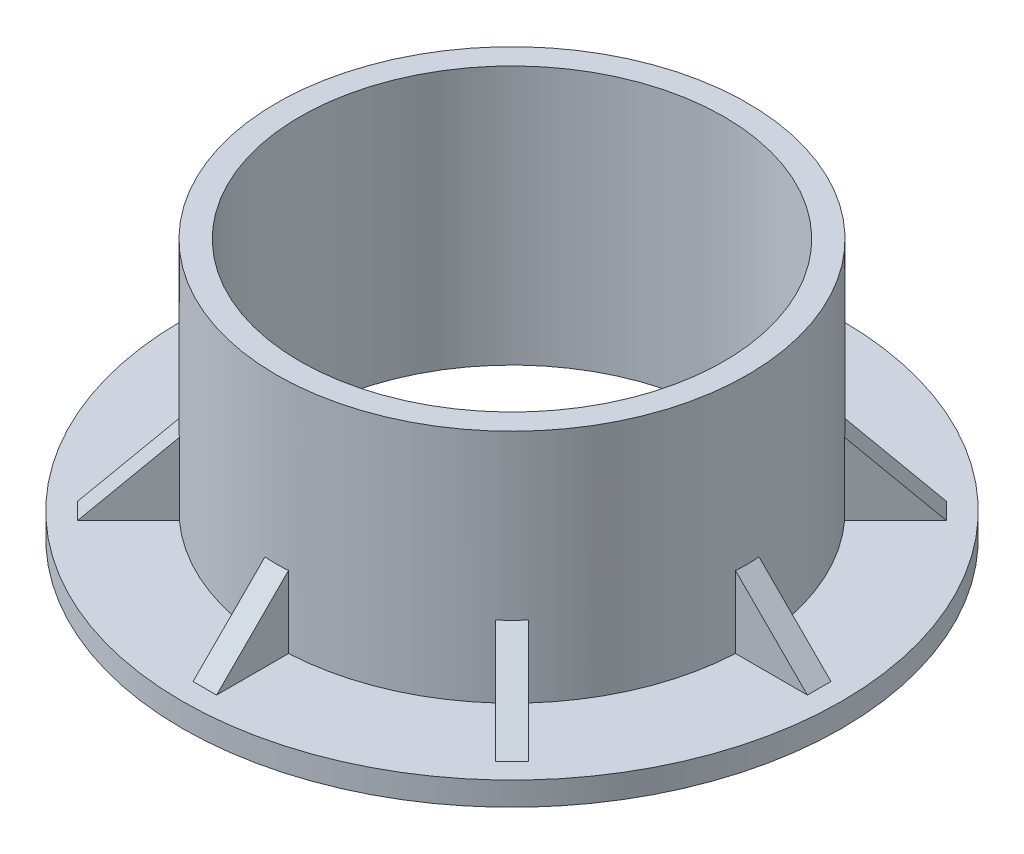
ISO-10303-21;
HEADER;
FILE_DESCRIPTION(('STEP AP214'),'2;1');
FILE_NAME('part.step','',(''),(''),'','','');
FILE_SCHEMA(('AUTOMOTIVE_DESIGN { 1 0 10303 214 1 1 1 1 }'));
ENDSEC;
DATA;
#1=APPLICATION_CONTEXT('core data for automotive mechanical design processes');
#2=APPLICATION_PROTOCOL_DEFINITION('international standard','automotive_design',2000,#1);
#3=PRODUCT_CONTEXT('',#1,'mechanical');
#4=PRODUCT('Part','Part','',(#3));
#5=PRODUCT_RELATED_PRODUCT_CATEGORY('part','',(#4));
#6=PRODUCT_DEFINITION_FORMATION('','',#4);
#7=PRODUCT_DEFINITION_CONTEXT('part definition',#1,'design');
#8=PRODUCT_DEFINITION('design','',#6,#7);
#9=PRODUCT_DEFINITION_SHAPE('','',#8);
#10=(LENGTH_UNIT() NAMED_UNIT(*) SI_UNIT(.MILLI.,.METRE.));
#11=(NAMED_UNIT(*) PLANE_ANGLE_UNIT() SI_UNIT($,.RADIAN.));
#12=(NAMED_UNIT(*) SI_UNIT($,.STERADIAN.) SOLID_ANGLE_UNIT());
#13=UNCERTAINTY_MEASURE_WITH_UNIT(LENGTH_MEASURE(1.E-05),#10,'distance_accuracy_value','');
#14=(GEOMETRIC_REPRESENTATION_CONTEXT(3) GLOBAL_UNCERTAINTY_ASSIGNED_CONTEXT((#13)) GLOBAL_UNIT_ASSIGNED_CONTEXT((#10,
#11,#12)) REPRESENTATION_CONTEXT('',''));
#15=CARTESIAN_POINT('',(0.,0.,0.));
#16=DIRECTION('',(0.,0.,1.));
#17=DIRECTION('',(1.,0.,0.));
#18=AXIS2_PLACEMENT_3D('',#15,#16,#17);
#19=CARTESIAN_POINT('',(0.,50.,0.));
#20=DIRECTION('',(0.,1.,0.));
#21=DIRECTION('',(0.,0.,1.));
#22=AXIS2_PLACEMENT_3D('',#19,#20,#21);
#23=PLANE('',#22);
#24=CARTESIAN_POINT('',(0.,50.,0.));
#25=DIRECTION('',(0.,1.,0.));
#26=DIRECTION('',(0.,0.,1.));
#27=AXIS2_PLACEMENT_3D('',#24,#25,#26);
#28=CIRCLE('',#27,50.);
#29=CARTESIAN_POINT('',(0.,50.,50.));
#30=VERTEX_POINT('',#29);
#31=EDGE_CURVE('E11',#30,#30,#28,.T.);
#32=ORIENTED_EDGE('',*,*,#31,.T.);
#33=EDGE_LOOP('',(#32));
#34=FACE_BOUND('',#33,.T.);
#35=CARTESIAN_POINT('',(0.,50.,0.));
#36=DIRECTION('',(0.,1.,0.));
#37=DIRECTION('',(0.,0.,1.));
#38=AXIS2_PLACEMENT_3D('',#35,#36,#37);
#39=CIRCLE('',#38,45.);
#40=CARTESIAN_POINT('',(0.,50.,45.));
#41=VERTEX_POINT('',#40);
#42=EDGE_CURVE('E41',#41,#41,#39,.T.);
#43=ORIENTED_EDGE('',*,*,#42,.F.);
#44=EDGE_LOOP('',(#43));
#45=FACE_BOUND('',#44,.T.);
#46=ADVANCED_FACE('F33',(#34,#45),#23,.T.);
#47=CARTESIAN_POINT('',(0.,50.,0.));
#48=DIRECTION('',(0.,-1.,0.));
#49=DIRECTION('',(0.,0.,-1.));
#50=AXIS2_PLACEMENT_3D('',#47,#48,#49);
#51=CYLINDRICAL_SURFACE('',#50,50.);
#52=ORIENTED_EDGE('',*,*,#31,.F.);
#53=EDGE_LOOP('',(#52));
#54=FACE_BOUND('',#53,.T.);
#55=DIRECTION('',(0.,-1.,0.));
#56=VECTOR('',#55,1.);
#57=CARTESIAN_POINT('',(-33.5433502765973,50.,-37.0788841825304));
#58=LINE('',#57,#56);
#59=CARTESIAN_POINT('',(-33.5433502765973,15.2819727855431,-37.0788841825304));
#60=VERTEX_POINT('',#59);
#61=CARTESIAN_POINT('',(-33.5433502765973,0.,-37.0788841825304));
#62=VERTEX_POINT('',#61);
#63=EDGE_CURVE('E289',#60,#62,#58,.T.);
#64=ORIENTED_EDGE('',*,*,#63,.F.);
#65=CARTESIAN_POINT('',(0.,65.2194336741394,0.));
#66=DIRECTION('',(-0.500000000000002,0.707106781186541,-0.500000000000007));
#67=DIRECTION('',(-0.499999999999993,-0.707106781186554,-0.499999999999998));
#68=AXIS2_PLACEMENT_3D('',#65,#66,#67);
#69=ELLIPSE('',#68,70.7106781186554,50.);
#70=CARTESIAN_POINT('',(-37.07888418253,15.2819727855431,-33.5433502765977));
#71=VERTEX_POINT('',#70);
#72=EDGE_CURVE('E298',#60,#71,#69,.T.);
#73=ORIENTED_EDGE('',*,*,#72,.T.);
#74=DIRECTION('',(0.,-1.,0.));
#75=VECTOR('',#74,1.);
#76=CARTESIAN_POINT('',(-37.07888418253,50.,-33.5433502765977));
#77=LINE('',#76,#75);
#78=CARTESIAN_POINT('',(-37.07888418253,0.,-33.5433502765977));
#79=VERTEX_POINT('',#78);
#80=EDGE_CURVE('E294',#71,#79,#77,.T.);
#81=ORIENTED_EDGE('',*,*,#80,.T.);
#82=CARTESIAN_POINT('',(0.,0.,0.));
#83=DIRECTION('',(0.,-1.,0.));
#84=DIRECTION('',(0.,0.,-1.));
#85=AXIS2_PLACEMENT_3D('',#82,#83,#84);
#86=CIRCLE('',#85,50.);
#87=CARTESIAN_POINT('',(-49.9374608885954,0.,-2.50000000000017));
#88=VERTEX_POINT('',#87);
#89=EDGE_CURVE('E514',#88,#79,#86,.T.);
#90=ORIENTED_EDGE('',*,*,#89,.F.);
#91=DIRECTION('',(0.,-1.,0.));
#92=VECTOR('',#91,1.);
#93=CARTESIAN_POINT('',(-49.9374608885954,50.,-2.50000000000017));
#94=LINE('',#93,#92);
#95=CARTESIAN_POINT('',(-49.9374608885954,15.2819727855431,-2.50000000000017));
#96=VERTEX_POINT('',#95);
#97=EDGE_CURVE('E309',#96,#88,#94,.T.);
#98=ORIENTED_EDGE('',*,*,#97,.F.);
#99=CARTESIAN_POINT('',(0.,65.2194336741394,0.));
#100=DIRECTION('',(-0.707106781186554,0.707106781186541,0.));
#101=DIRECTION('',(-0.707106781186541,-0.707106781186554,0.));
#102=AXIS2_PLACEMENT_3D('',#99,#100,#101);
#103=ELLIPSE('',#102,70.7106781186554,50.);
#104=CARTESIAN_POINT('',(-49.9374608885955,15.2819727855431,2.49999999999983));
#105=VERTEX_POINT('',#104);
#106=EDGE_CURVE('E318',#96,#105,#103,.T.);
#107=ORIENTED_EDGE('',*,*,#106,.T.);
#108=DIRECTION('',(0.,-1.,0.));
#109=VECTOR('',#108,1.);
#110=CARTESIAN_POINT('',(-49.9374608885955,50.,2.49999999999983));
#111=LINE('',#110,#109);
#112=CARTESIAN_POINT('',(-49.9374608885955,0.,2.49999999999983));
#113=VERTEX_POINT('',#112);
#114=EDGE_CURVE('E314',#105,#113,#111,.T.);
#115=ORIENTED_EDGE('',*,*,#114,.T.);
#116=CARTESIAN_POINT('',(-37.0788841825303,0.,33.5433502765974));
#117=VERTEX_POINT('',#116);
#118=EDGE_CURVE('E373',#117,#113,#86,.T.);
#119=ORIENTED_EDGE('',*,*,#118,.F.);
#120=DIRECTION('',(0.,-1.,0.));
#121=VECTOR('',#120,1.);
#122=CARTESIAN_POINT('',(-37.0788841825303,50.,33.5433502765974));
#123=LINE('',#122,#121);
#124=CARTESIAN_POINT('',(-37.0788841825303,15.2819727855431,33.5433502765974));
#125=VERTEX_POINT('',#124);
#126=EDGE_CURVE('E329',#125,#117,#123,.T.);
#127=ORIENTED_EDGE('',*,*,#126,.F.);
#128=CARTESIAN_POINT('',(0.,65.2194336741394,0.));
#129=DIRECTION('',(-0.500000000000005,0.707106781186542,0.500000000000003));
#130=DIRECTION('',(-0.499999999999997,-0.707106781186554,0.499999999999995));
#131=AXIS2_PLACEMENT_3D('',#128,#129,#130);
#132=ELLIPSE('',#131,70.7106781186554,50.);
#133=CARTESIAN_POINT('',(-33.5433502765975,15.2819727855431,37.0788841825302));
#134=VERTEX_POINT('',#133);
#135=EDGE_CURVE('E338',#125,#134,#132,.T.);
#136=ORIENTED_EDGE('',*,*,#135,.T.);
#137=DIRECTION('',(0.,-1.,0.));
#138=VECTOR('',#137,1.);
#139=CARTESIAN_POINT('',(-33.5433502765975,50.,37.0788841825302));
#140=LINE('',#139,#138);
#141=CARTESIAN_POINT('',(-33.5433502765975,0.,37.0788841825302));
#142=VERTEX_POINT('',#141);
#143=EDGE_CURVE('E334',#134,#142,#140,.T.);
#144=ORIENTED_EDGE('',*,*,#143,.T.);
#145=CARTESIAN_POINT('',(-2.5,0.,49.9374608885955));
#146=VERTEX_POINT('',#145);
#147=EDGE_CURVE('E371',#146,#142,#86,.T.);
#148=ORIENTED_EDGE('',*,*,#147,.F.);
#149=DIRECTION('',(0.,-1.,0.));
#150=VECTOR('',#149,1.);
#151=CARTESIAN_POINT('',(-2.5,50.,49.9374608885955));
#152=LINE('',#151,#150);
#153=CARTESIAN_POINT('',(-2.5,15.2819727855431,49.9374608885955));
#154=VERTEX_POINT('',#153);
#155=EDGE_CURVE('E349',#154,#146,#152,.T.);
#156=ORIENTED_EDGE('',*,*,#155,.F.);
#157=CARTESIAN_POINT('',(0.,65.2194336741394,0.));
#158=DIRECTION('',(0.,0.707106781186541,0.707106781186554));
#159=DIRECTION('',(0.,-0.707106781186554,0.707106781186541));
#160=AXIS2_PLACEMENT_3D('',#157,#158,#159);
#161=ELLIPSE('',#160,70.7106781186554,50.);
#162=CARTESIAN_POINT('',(2.5,15.2819727855431,49.9374608885954));
#163=VERTEX_POINT('',#162);
#164=EDGE_CURVE('E359',#154,#163,#161,.T.);
#165=ORIENTED_EDGE('',*,*,#164,.T.);
#166=DIRECTION('',(0.,-1.,0.));
#167=VECTOR('',#166,1.);
#168=CARTESIAN_POINT('',(2.5,50.,49.9374608885955));
#169=LINE('',#168,#167);
#170=CARTESIAN_POINT('',(2.5,0.,49.9374608885955));
#171=VERTEX_POINT('',#170);
#172=EDGE_CURVE('E354',#163,#171,#169,.T.);
#173=ORIENTED_EDGE('',*,*,#172,.T.);
#174=CARTESIAN_POINT('',(33.543350276597,0.,37.0788841825306));
#175=VERTEX_POINT('',#174);
#176=EDGE_CURVE('E368',#175,#171,#86,.T.);
#177=ORIENTED_EDGE('',*,*,#176,.F.);
#178=DIRECTION('',(0.,-1.,0.));
#179=VECTOR('',#178,1.);
#180=CARTESIAN_POINT('',(33.543350276597,50.,37.0788841825306));
#181=LINE('',#180,#179);
#182=CARTESIAN_POINT('',(33.543350276597,15.2819727855431,37.0788841825306));
#183=VERTEX_POINT('',#182);
#184=EDGE_CURVE('E53',#183,#175,#181,.T.);
#185=ORIENTED_EDGE('',*,*,#184,.F.);
#186=CARTESIAN_POINT('',(0.,65.2194336741394,0.));
#187=DIRECTION('',(0.499999999999998,0.707106781186542,0.50000000000001));
#188=DIRECTION('',(0.49999999999999,-0.707106781186554,0.500000000000002));
#189=AXIS2_PLACEMENT_3D('',#186,#187,#188);
#190=ELLIPSE('',#189,70.7106781186554,50.);
#191=CARTESIAN_POINT('',(37.0788841825298,15.2819727855431,33.5433502765979));
#192=VERTEX_POINT('',#191);
#193=EDGE_CURVE('E48',#183,#192,#190,.T.);
#194=ORIENTED_EDGE('',*,*,#193,.T.);
#195=DIRECTION('',(0.,-1.,0.));
#196=VECTOR('',#195,1.);
#197=CARTESIAN_POINT('',(37.0788841825298,50.,33.5433502765979));
#198=LINE('',#197,#196);
#199=CARTESIAN_POINT('',(37.0788841825298,0.,33.5433502765979));
#200=VERTEX_POINT('',#199);
#201=EDGE_CURVE('E209',#192,#200,#198,.T.);
#202=ORIENTED_EDGE('',*,*,#201,.T.);
#203=CARTESIAN_POINT('',(49.9374608885954,0.,2.50000000000052));
#204=VERTEX_POINT('',#203);
#205=EDGE_CURVE('E493',#204,#200,#86,.T.);
#206=ORIENTED_EDGE('',*,*,#205,.F.);
#207=DIRECTION('',(0.,-1.,0.));
#208=VECTOR('',#207,1.);
#209=CARTESIAN_POINT('',(49.9374608885954,50.,2.50000000000052));
#210=LINE('',#209,#208);
#211=CARTESIAN_POINT('',(49.9374608885954,15.2819727855431,2.50000000000052));
#212=VERTEX_POINT('',#211);
#213=EDGE_CURVE('E233',#212,#204,#210,.T.);
#214=ORIENTED_EDGE('',*,*,#213,.F.);
#215=CARTESIAN_POINT('',(0.,65.2194336741394,0.));
#216=DIRECTION('',(0.707106781186554,0.707106781186541,0.));
#217=DIRECTION('',(0.707106781186541,-0.707106781186554,0.));
#218=AXIS2_PLACEMENT_3D('',#215,#216,#217);
#219=ELLIPSE('',#218,70.7106781186554,50.);
#220=CARTESIAN_POINT('',(49.9374608885955,15.2819727855431,-2.49999999999948));
#221=VERTEX_POINT('',#220);
#222=EDGE_CURVE('E238',#212,#221,#219,.T.);
#223=ORIENTED_EDGE('',*,*,#222,.T.);
#224=DIRECTION('',(0.,-1.,0.));
#225=VECTOR('',#224,1.);
#226=CARTESIAN_POINT('',(49.9374608885955,50.,-2.49999999999948));
#227=LINE('',#226,#225);
#228=CARTESIAN_POINT('',(49.9374608885955,0.,-2.49999999999948));
#229=VERTEX_POINT('',#228);
#230=EDGE_CURVE('E228',#221,#229,#227,.T.);
#231=ORIENTED_EDGE('',*,*,#230,.T.);
#232=CARTESIAN_POINT('',(37.0788841825305,0.,-33.5433502765971));
#233=VERTEX_POINT('',#232);
#234=EDGE_CURVE('E494',#233,#229,#86,.T.);
#235=ORIENTED_EDGE('',*,*,#234,.F.);
#236=DIRECTION('',(0.,-1.,0.));
#237=VECTOR('',#236,1.);
#238=CARTESIAN_POINT('',(37.0788841825305,50.,-33.5433502765971));
#239=LINE('',#238,#237);
#240=CARTESIAN_POINT('',(37.0788841825305,15.2819727855431,-33.5433502765971));
#241=VERTEX_POINT('',#240);
#242=EDGE_CURVE('E253',#241,#233,#239,.T.);
#243=ORIENTED_EDGE('',*,*,#242,.F.);
#244=CARTESIAN_POINT('',(0.,65.2194336741394,0.));
#245=DIRECTION('',(0.500000000000009,0.707106781186541,-0.5));
#246=DIRECTION('',(0.5,-0.707106781186554,-0.499999999999991));
#247=AXIS2_PLACEMENT_3D('',#244,#245,#246);
#248=ELLIPSE('',#247,70.7106781186554,50.);
#249=CARTESIAN_POINT('',(33.5433502765978,15.2819727855431,-37.0788841825299));
#250=VERTEX_POINT('',#249);
#251=EDGE_CURVE('E258',#241,#250,#248,.T.);
#252=ORIENTED_EDGE('',*,*,#251,.T.);
#253=DIRECTION('',(0.,-1.,0.));
#254=VECTOR('',#253,1.);
#255=CARTESIAN_POINT('',(33.5433502765978,50.,-37.0788841825299));
#256=LINE('',#255,#254);
#257=CARTESIAN_POINT('',(33.5433502765978,0.,-37.0788841825299));
#258=VERTEX_POINT('',#257);
#259=EDGE_CURVE('E248',#250,#258,#256,.T.);
#260=ORIENTED_EDGE('',*,*,#259,.T.);
#261=CARTESIAN_POINT('',(2.5,0.,-49.9374608885955));
#262=VERTEX_POINT('',#261);
#263=EDGE_CURVE('E496',#262,#258,#86,.T.);
#264=ORIENTED_EDGE('',*,*,#263,.F.);
#265=DIRECTION('',(0.,-1.,0.));
#266=VECTOR('',#265,1.);
#267=CARTESIAN_POINT('',(2.5,50.,-49.9374608885955));
#268=LINE('',#267,#266);
#269=CARTESIAN_POINT('',(2.5,15.2819727855431,-49.9374608885955));
#270=VERTEX_POINT('',#269);
#271=EDGE_CURVE('E273',#270,#262,#268,.T.);
#272=ORIENTED_EDGE('',*,*,#271,.F.);
#273=CARTESIAN_POINT('',(0.,65.2194336741394,0.));
#274=DIRECTION('',(0.,0.707106781186541,-0.707106781186554));
#275=DIRECTION('',(0.,-0.707106781186554,-0.707106781186541));
#276=AXIS2_PLACEMENT_3D('',#273,#274,#275);
#277=ELLIPSE('',#276,70.7106781186554,50.);
#278=CARTESIAN_POINT('',(-2.5,15.2819727855431,-49.9374608885954));
#279=VERTEX_POINT('',#278);
#280=EDGE_CURVE('E278',#270,#279,#277,.T.);
#281=ORIENTED_EDGE('',*,*,#280,.T.);
#282=DIRECTION('',(0.,-1.,0.));
#283=VECTOR('',#282,1.);
#284=CARTESIAN_POINT('',(-2.5,50.,-49.9374608885955));
#285=LINE('',#284,#283);
#286=CARTESIAN_POINT('',(-2.5,0.,-49.9374608885955));
#287=VERTEX_POINT('',#286);
#288=EDGE_CURVE('E268',#279,#287,#285,.T.);
#289=ORIENTED_EDGE('',*,*,#288,.T.);
#290=EDGE_CURVE('E516',#62,#287,#86,.T.);
#291=ORIENTED_EDGE('',*,*,#290,.F.);
#292=EDGE_LOOP('',(#64,#73,#81,#90,#98,#107,#115,#119,#127,#136,#144,#148,#156,#165,#173,#177,
#185,#194,#202,#206,#214,#223,#231,#235,#243,#252,#260,#264,#272,#281,#289,#291));
#293=FACE_BOUND('',#292,.T.);
#294=ADVANCED_FACE('F35',(#54,#293),#51,.T.);
#295=CARTESIAN_POINT('',(0.,50.,0.));
#296=DIRECTION('',(0.,-1.,0.));
#297=DIRECTION('',(0.,0.,-1.));
#298=AXIS2_PLACEMENT_3D('',#295,#296,#297);
#299=CYLINDRICAL_SURFACE('',#298,45.);
#300=CARTESIAN_POINT('',(0.,-5.,0.));
#301=DIRECTION('',(0.,-1.,0.));
#302=DIRECTION('',(0.,0.,-1.));
#303=AXIS2_PLACEMENT_3D('',#300,#301,#302);
#304=CIRCLE('',#303,45.);
#305=CARTESIAN_POINT('',(0.,-5.,-45.));
#306=VERTEX_POINT('',#305);
#307=EDGE_CURVE('E361',#306,#306,#304,.T.);
#308=ORIENTED_EDGE('',*,*,#307,.T.);
#309=EDGE_LOOP('',(#308));
#310=FACE_BOUND('',#309,.T.);
#311=ORIENTED_EDGE('',*,*,#42,.T.);
#312=EDGE_LOOP('',(#311));
#313=FACE_BOUND('',#312,.T.);
#314=ADVANCED_FACE('F377',(#310,#313),#299,.F.);
#315=CARTESIAN_POINT('',(0.,0.,0.));
#316=DIRECTION('',(0.,-1.,0.));
#317=DIRECTION('',(0.,0.,-1.));
#318=AXIS2_PLACEMENT_3D('',#315,#316,#317);
#319=PLANE('',#318);
#320=DIRECTION('',(0.707106781186551,0.,-0.707106781186544));
#321=VECTOR('',#320,1.);
#322=CARTESIAN_POINT('',(-46.1171038161292,0.,-46.1171038161297));
#323=LINE('',#322,#321);
#324=CARTESIAN_POINT('',(-47.8848707690956,0.,-44.3493368631633));
#325=VERTEX_POINT('',#324);
#326=CARTESIAN_POINT('',(-44.3493368631628,0.,-47.8848707690961));
#327=VERTEX_POINT('',#326);
#328=EDGE_CURVE('E296',#325,#327,#323,.T.);
#329=ORIENTED_EDGE('',*,*,#328,.T.);
#330=DIRECTION('',(-0.707106781186544,0.,-0.707106781186551));
#331=VECTOR('',#330,1.);
#332=CARTESIAN_POINT('',(1.76776695296638,0.,-1.76776695296636));
#333=LINE('',#332,#331);
#334=EDGE_CURVE('E284',#62,#327,#333,.T.);
#335=ORIENTED_EDGE('',*,*,#334,.F.);
#336=ORIENTED_EDGE('',*,*,#290,.T.);
#337=DIRECTION('',(0.,0.,-1.));
#338=VECTOR('',#337,1.);
#339=CARTESIAN_POINT('',(-2.5,0.,0.));
#340=LINE('',#339,#338);
#341=CARTESIAN_POINT('',(-2.5,0.,-65.2194336741383));
#342=VERTEX_POINT('',#341);
#343=EDGE_CURVE('E264',#287,#342,#340,.T.);
#344=ORIENTED_EDGE('',*,*,#343,.T.);
#345=DIRECTION('',(1.,0.,0.));
#346=VECTOR('',#345,1.);
#347=CARTESIAN_POINT('',(0.,0.,-65.2194336741383));
#348=LINE('',#347,#346);
#349=CARTESIAN_POINT('',(2.5,0.,-65.2194336741383));
#350=VERTEX_POINT('',#349);
#351=EDGE_CURVE('E276',#342,#350,#348,.T.);
#352=ORIENTED_EDGE('',*,*,#351,.T.);
#353=DIRECTION('',(0.,0.,-1.));
#354=VECTOR('',#353,1.);
#355=CARTESIAN_POINT('',(2.5,0.,0.));
#356=LINE('',#355,#354);
#357=EDGE_CURVE('E270',#262,#350,#356,.T.);
#358=ORIENTED_EDGE('',*,*,#357,.F.);
#359=ORIENTED_EDGE('',*,*,#263,.T.);
#360=DIRECTION('',(0.707106781186554,0.,-0.707106781186541));
#361=VECTOR('',#360,1.);
#362=CARTESIAN_POINT('',(-1.76776695296635,0.,-1.76776695296638));
#363=LINE('',#362,#361);
#364=CARTESIAN_POINT('',(44.3493368631635,0.,-47.8848707690954));
#365=VERTEX_POINT('',#364);
#366=EDGE_CURVE('E244',#258,#365,#363,.T.);
#367=ORIENTED_EDGE('',*,*,#366,.T.);
#368=DIRECTION('',(0.707106781186541,0.,0.707106781186554));
#369=VECTOR('',#368,1.);
#370=CARTESIAN_POINT('',(46.1171038161299,0.,-46.1171038161291));
#371=LINE('',#370,#369);
#372=CARTESIAN_POINT('',(47.8848707690962,0.,-44.3493368631627));
#373=VERTEX_POINT('',#372);
#374=EDGE_CURVE('E256',#365,#373,#371,.T.);
#375=ORIENTED_EDGE('',*,*,#374,.T.);
#376=DIRECTION('',(0.707106781186554,0.,-0.707106781186541));
#377=VECTOR('',#376,1.);
#378=CARTESIAN_POINT('',(1.76776695296636,0.,1.76776695296639));
#379=LINE('',#378,#377);
#380=EDGE_CURVE('E250',#233,#373,#379,.T.);
#381=ORIENTED_EDGE('',*,*,#380,.F.);
#382=ORIENTED_EDGE('',*,*,#234,.T.);
#383=DIRECTION('',(1.,0.,0.));
#384=VECTOR('',#383,1.);
#385=CARTESIAN_POINT('',(0.,0.,-2.5));
#386=LINE('',#385,#384);
#387=CARTESIAN_POINT('',(65.2194336741383,0.,-2.5000000000005));
#388=VERTEX_POINT('',#387);
#389=EDGE_CURVE('E224',#229,#388,#386,.T.);
#390=ORIENTED_EDGE('',*,*,#389,.T.);
#391=DIRECTION('',(0.,0.,1.));
#392=VECTOR('',#391,1.);
#393=CARTESIAN_POINT('',(65.2194336741383,0.,6.83137306809514E-13));
#394=LINE('',#393,#392);
#395=CARTESIAN_POINT('',(65.2194336741383,0.,2.50000000000068));
#396=VERTEX_POINT('',#395);
#397=EDGE_CURVE('E236',#388,#396,#394,.T.);
#398=ORIENTED_EDGE('',*,*,#397,.T.);
#399=DIRECTION('',(1.,0.,0.));
#400=VECTOR('',#399,1.);
#401=CARTESIAN_POINT('',(0.,0.,2.5));
#402=LINE('',#401,#400);
#403=EDGE_CURVE('E230',#204,#396,#402,.T.);
#404=ORIENTED_EDGE('',*,*,#403,.F.);
#405=ORIENTED_EDGE('',*,*,#205,.T.);
#406=DIRECTION('',(0.707106781186539,0.,0.707106781186556));
#407=VECTOR('',#406,1.);
#408=CARTESIAN_POINT('',(1.76776695296639,0.,-1.76776695296635));
#409=LINE('',#408,#407);
#410=CARTESIAN_POINT('',(47.8848707690953,0.,44.3493368631637));
#411=VERTEX_POINT('',#410);
#412=EDGE_CURVE('E199',#200,#411,#409,.T.);
#413=ORIENTED_EDGE('',*,*,#412,.T.);
#414=DIRECTION('',(-0.707106781186556,0.,0.707106781186539));
#415=VECTOR('',#414,1.);
#416=CARTESIAN_POINT('',(46.1171038161289,0.,46.11710381613));
#417=LINE('',#416,#415);
#418=CARTESIAN_POINT('',(44.3493368631625,0.,47.8848707690964));
#419=VERTEX_POINT('',#418);
#420=EDGE_CURVE('E192',#411,#419,#417,.T.);
#421=ORIENTED_EDGE('',*,*,#420,.T.);
#422=DIRECTION('',(0.707106781186539,0.,0.707106781186556));
#423=VECTOR('',#422,1.);
#424=CARTESIAN_POINT('',(-1.76776695296639,0.,1.76776695296635));
#425=LINE('',#424,#423);
#426=EDGE_CURVE('E196',#175,#419,#425,.T.);
#427=ORIENTED_EDGE('',*,*,#426,.F.);
#428=ORIENTED_EDGE('',*,*,#176,.T.);
#429=DIRECTION('',(0.,0.,1.));
#430=VECTOR('',#429,1.);
#431=CARTESIAN_POINT('',(2.5,0.,0.));
#432=LINE('',#431,#430);
#433=CARTESIAN_POINT('',(2.5,0.,65.2194336741383));
#434=VERTEX_POINT('',#433);
#435=EDGE_CURVE('E352',#171,#434,#432,.T.);
#436=ORIENTED_EDGE('',*,*,#435,.T.);
#437=DIRECTION('',(-1.,0.,0.));
#438=VECTOR('',#437,1.);
#439=CARTESIAN_POINT('',(0.,0.,65.2194336741383));
#440=LINE('',#439,#438);
#441=CARTESIAN_POINT('',(-2.5,0.,65.2194336741383));
#442=VERTEX_POINT('',#441);
#443=EDGE_CURVE('E357',#434,#442,#440,.T.);
#444=ORIENTED_EDGE('',*,*,#443,.T.);
#445=DIRECTION('',(0.,0.,1.));
#446=VECTOR('',#445,1.);
#447=CARTESIAN_POINT('',(-2.5,0.,0.));
#448=LINE('',#447,#446);
#449=EDGE_CURVE('E344',#146,#442,#448,.T.);
#450=ORIENTED_EDGE('',*,*,#449,.F.);
#451=ORIENTED_EDGE('',*,*,#147,.T.);
#452=DIRECTION('',(-0.707106781186549,0.,0.707106781186546));
#453=VECTOR('',#452,1.);
#454=CARTESIAN_POINT('',(1.76776695296637,0.,1.76776695296637));
#455=LINE('',#454,#453);
#456=CARTESIAN_POINT('',(-44.3493368631632,0.,47.8848707690958));
#457=VERTEX_POINT('',#456);
#458=EDGE_CURVE('E332',#142,#457,#455,.T.);
#459=ORIENTED_EDGE('',*,*,#458,.T.);
#460=DIRECTION('',(-0.707106781186546,0.,-0.707106781186549));
#461=VECTOR('',#460,1.);
#462=CARTESIAN_POINT('',(-46.1171038161295,0.,46.1171038161294));
#463=LINE('',#462,#461);
#464=CARTESIAN_POINT('',(-47.8848707690959,0.,44.349336863163));
#465=VERTEX_POINT('',#464);
#466=EDGE_CURVE('E336',#457,#465,#463,.T.);
#467=ORIENTED_EDGE('',*,*,#466,.T.);
#468=DIRECTION('',(-0.707106781186549,0.,0.707106781186546));
#469=VECTOR('',#468,1.);
#470=CARTESIAN_POINT('',(-1.76776695296637,0.,-1.76776695296637));
#471=LINE('',#470,#469);
#472=EDGE_CURVE('E324',#117,#465,#471,.T.);
#473=ORIENTED_EDGE('',*,*,#472,.F.);
#474=ORIENTED_EDGE('',*,*,#118,.T.);
#475=DIRECTION('',(-1.,0.,0.));
#476=VECTOR('',#475,1.);
#477=CARTESIAN_POINT('',(0.,0.,2.5));
#478=LINE('',#477,#476);
#479=CARTESIAN_POINT('',(-65.2194336741383,0.,2.50000000000017));
#480=VERTEX_POINT('',#479);
#481=EDGE_CURVE('E312',#113,#480,#478,.T.);
#482=ORIENTED_EDGE('',*,*,#481,.T.);
#483=DIRECTION('',(0.,0.,-1.));
#484=VECTOR('',#483,1.);
#485=CARTESIAN_POINT('',(-65.2194336741383,0.,-2.27712435603171E-13));
#486=LINE('',#485,#484);
#487=CARTESIAN_POINT('',(-65.2194336741383,0.,-2.50000000000023));
#488=VERTEX_POINT('',#487);
#489=EDGE_CURVE('E316',#480,#488,#486,.T.);
#490=ORIENTED_EDGE('',*,*,#489,.T.);
#491=DIRECTION('',(-1.,0.,0.));
#492=VECTOR('',#491,1.);
#493=CARTESIAN_POINT('',(0.,0.,-2.5));
#494=LINE('',#493,#492);
#495=EDGE_CURVE('E304',#88,#488,#494,.T.);
#496=ORIENTED_EDGE('',*,*,#495,.F.);
#497=ORIENTED_EDGE('',*,*,#89,.T.);
#498=DIRECTION('',(-0.707106781186544,0.,-0.707106781186551));
#499=VECTOR('',#498,1.);
#500=CARTESIAN_POINT('',(-1.76776695296638,0.,1.76776695296636));
#501=LINE('',#500,#499);
#502=EDGE_CURVE('E292',#79,#325,#501,.T.);
#503=ORIENTED_EDGE('',*,*,#502,.T.);
#504=EDGE_LOOP('',(#329,#335,#336,#344,#352,#358,#359,#367,#375,#381,#382,#390,#398,#404,#405,
#413,#421,#427,#428,#436,#444,#450,#451,#459,#467,#473,#474,#482,#490,#496,#497,#503));
#505=FACE_BOUND('',#504,.T.);
#506=CARTESIAN_POINT('',(0.,0.,0.));
#507=DIRECTION('',(0.,-1.,0.));
#508=DIRECTION('',(0.,0.,-1.));
#509=AXIS2_PLACEMENT_3D('',#506,#507,#508);
#510=CIRCLE('',#509,70.);
#511=CARTESIAN_POINT('',(0.,0.,-70.));
#512=VERTEX_POINT('',#511);
#513=EDGE_CURVE('E364',#512,#512,#510,.T.);
#514=ORIENTED_EDGE('',*,*,#513,.F.);
#515=EDGE_LOOP('',(#514));
#516=FACE_BOUND('',#515,.T.);
#517=ADVANCED_FACE('F194',(#505,#516),#319,.F.);
#518=CARTESIAN_POINT('',(0.,-5.,0.));
#519=DIRECTION('',(0.,-1.,0.));
#520=DIRECTION('',(0.,0.,-1.));
#521=AXIS2_PLACEMENT_3D('',#518,#519,#520);
#522=PLANE('',#521);
#523=ORIENTED_EDGE('',*,*,#307,.F.);
#524=EDGE_LOOP('',(#523));
#525=FACE_BOUND('',#524,.T.);
#526=CARTESIAN_POINT('',(0.,-5.,0.));
#527=DIRECTION('',(0.,-1.,0.));
#528=DIRECTION('',(0.,0.,-1.));
#529=AXIS2_PLACEMENT_3D('',#526,#527,#528);
#530=CIRCLE('',#529,70.);
#531=CARTESIAN_POINT('',(0.,-5.,-70.));
#532=VERTEX_POINT('',#531);
#533=EDGE_CURVE('E365',#532,#532,#530,.T.);
#534=ORIENTED_EDGE('',*,*,#533,.T.);
#535=EDGE_LOOP('',(#534));
#536=FACE_BOUND('',#535,.T.);
#537=ADVANCED_FACE('F393',(#525,#536),#522,.T.);
#538=CARTESIAN_POINT('',(0.,-5.,0.));
#539=DIRECTION('',(0.,1.,0.));
#540=DIRECTION('',(0.,0.,1.));
#541=AXIS2_PLACEMENT_3D('',#538,#539,#540);
#542=CYLINDRICAL_SURFACE('',#541,70.);
#543=ORIENTED_EDGE('',*,*,#513,.T.);
#544=EDGE_LOOP('',(#543));
#545=FACE_BOUND('',#544,.T.);
#546=ORIENTED_EDGE('',*,*,#533,.F.);
#547=EDGE_LOOP('',(#546));
#548=FACE_BOUND('',#547,.T.);
#549=ADVANCED_FACE('F389',(#545,#548),#542,.T.);
#550=CARTESIAN_POINT('',(0.,13.0447653467907,52.1746683273479));
#551=DIRECTION('',(0.,0.707106781186541,0.707106781186554));
#552=DIRECTION('',(0.,-0.707106781186554,0.707106781186541));
#553=AXIS2_PLACEMENT_3D('',#550,#551,#552);
#554=PLANE('',#553);
#555=ORIENTED_EDGE('',*,*,#164,.F.);
#556=DIRECTION('',(0.,-0.707106781186554,0.707106781186541));
#557=VECTOR('',#556,1.);
#558=CARTESIAN_POINT('',(-2.5,13.0447653467907,52.1746683273479));
#559=LINE('',#558,#557);
#560=EDGE_CURVE('E340',#154,#442,#559,.T.);
#561=ORIENTED_EDGE('',*,*,#560,.T.);
#562=ORIENTED_EDGE('',*,*,#443,.F.);
#563=DIRECTION('',(0.,-0.707106781186554,0.707106781186541));
#564=VECTOR('',#563,1.);
#565=CARTESIAN_POINT('',(2.5,13.0447653467907,52.1746683273479));
#566=LINE('',#565,#564);
#567=EDGE_CURVE('E341',#163,#434,#566,.T.);
#568=ORIENTED_EDGE('',*,*,#567,.F.);
#569=EDGE_LOOP('',(#555,#561,#562,#568));
#570=FACE_BOUND('',#569,.T.);
#571=ADVANCED_FACE('F392',(#570),#554,.T.);
#572=CARTESIAN_POINT('',(2.5,22.5,0.));
#573=DIRECTION('',(1.,0.,0.));
#574=DIRECTION('',(0.,0.,-1.));
#575=AXIS2_PLACEMENT_3D('',#572,#573,#574);
#576=PLANE('',#575);
#577=ORIENTED_EDGE('',*,*,#172,.F.);
#578=ORIENTED_EDGE('',*,*,#567,.T.);
#579=ORIENTED_EDGE('',*,*,#435,.F.);
#580=EDGE_LOOP('',(#577,#578,#579));
#581=FACE_BOUND('',#580,.T.);
#582=ADVANCED_FACE('F402',(#581),#576,.T.);
#583=CARTESIAN_POINT('',(-2.5,22.5,0.));
#584=DIRECTION('',(1.,0.,0.));
#585=DIRECTION('',(0.,0.,-1.));
#586=AXIS2_PLACEMENT_3D('',#583,#584,#585);
#587=PLANE('',#586);
#588=ORIENTED_EDGE('',*,*,#560,.F.);
#589=ORIENTED_EDGE('',*,*,#155,.T.);
#590=ORIENTED_EDGE('',*,*,#449,.T.);
#591=EDGE_LOOP('',(#588,#589,#590));
#592=FACE_BOUND('',#591,.T.);
#593=ADVANCED_FACE('F404',(#592),#587,.F.);
#594=CARTESIAN_POINT('',(-36.8930617804267,13.0447653467907,36.8930617804266));
#595=DIRECTION('',(-0.500000000000005,0.707106781186542,0.500000000000003));
#596=DIRECTION('',(-0.499999999999997,-0.707106781186554,0.499999999999995));
#597=AXIS2_PLACEMENT_3D('',#594,#595,#596);
#598=PLANE('',#597);
#599=ORIENTED_EDGE('',*,*,#135,.F.);
#600=DIRECTION('',(-0.499999999999997,-0.707106781186554,0.499999999999995));
#601=VECTOR('',#600,1.);
#602=CARTESIAN_POINT('',(-38.6608287333931,13.0447653467907,35.1252948274602));
#603=LINE('',#602,#601);
#604=EDGE_CURVE('E320',#125,#465,#603,.T.);
#605=ORIENTED_EDGE('',*,*,#604,.T.);
#606=ORIENTED_EDGE('',*,*,#466,.F.);
#607=DIRECTION('',(-0.499999999999997,-0.707106781186554,0.499999999999995));
#608=VECTOR('',#607,1.);
#609=CARTESIAN_POINT('',(-35.1252948274603,13.0447653467907,38.660828733393));
#610=LINE('',#609,#608);
#611=EDGE_CURVE('E321',#134,#457,#610,.T.);
#612=ORIENTED_EDGE('',*,*,#611,.F.);
#613=EDGE_LOOP('',(#599,#605,#606,#612));
#614=FACE_BOUND('',#613,.T.);
#615=ADVANCED_FACE('F407',(#614),#598,.T.);
#616=CARTESIAN_POINT('',(1.76776695296637,22.5,1.76776695296637));
#617=DIRECTION('',(0.707106781186546,0.,0.707106781186549));
#618=DIRECTION('',(0.707106781186549,0.,-0.707106781186546));
#619=AXIS2_PLACEMENT_3D('',#616,#617,#618);
#620=PLANE('',#619);
#621=ORIENTED_EDGE('',*,*,#143,.F.);
#622=ORIENTED_EDGE('',*,*,#611,.T.);
#623=ORIENTED_EDGE('',*,*,#458,.F.);
#624=EDGE_LOOP('',(#621,#622,#623));
#625=FACE_BOUND('',#624,.T.);
#626=ADVANCED_FACE('F414',(#625),#620,.T.);
#627=CARTESIAN_POINT('',(-1.76776695296637,22.5,-1.76776695296637));
#628=DIRECTION('',(0.707106781186546,0.,0.707106781186549));
#629=DIRECTION('',(0.707106781186549,0.,-0.707106781186546));
#630=AXIS2_PLACEMENT_3D('',#627,#628,#629);
#631=PLANE('',#630);
#632=ORIENTED_EDGE('',*,*,#604,.F.);
#633=ORIENTED_EDGE('',*,*,#126,.T.);
#634=ORIENTED_EDGE('',*,*,#472,.T.);
#635=EDGE_LOOP('',(#632,#633,#634));
#636=FACE_BOUND('',#635,.T.);
#637=ADVANCED_FACE('F416',(#636),#631,.F.);
#638=CARTESIAN_POINT('',(-52.1746683273479,13.0447653467907,-1.82166880825265E-13));
#639=DIRECTION('',(-0.707106781186554,0.707106781186541,0.));
#640=DIRECTION('',(-0.707106781186541,-0.707106781186554,0.));
#641=AXIS2_PLACEMENT_3D('',#638,#639,#640);
#642=PLANE('',#641);
#643=ORIENTED_EDGE('',*,*,#106,.F.);
#644=DIRECTION('',(-0.707106781186541,-0.707106781186554,0.));
#645=VECTOR('',#644,1.);
#646=CARTESIAN_POINT('',(-52.1746683273478,13.0447653467907,-2.50000000000018));
#647=LINE('',#646,#645);
#648=EDGE_CURVE('E300',#96,#488,#647,.T.);
#649=ORIENTED_EDGE('',*,*,#648,.T.);
#650=ORIENTED_EDGE('',*,*,#489,.F.);
#651=DIRECTION('',(-0.707106781186541,-0.707106781186554,0.));
#652=VECTOR('',#651,1.);
#653=CARTESIAN_POINT('',(-52.1746683273479,13.0447653467907,2.49999999999982));
#654=LINE('',#653,#652);
#655=EDGE_CURVE('E301',#105,#480,#654,.T.);
#656=ORIENTED_EDGE('',*,*,#655,.F.);
#657=EDGE_LOOP('',(#643,#649,#650,#656));
#658=FACE_BOUND('',#657,.T.);
#659=ADVANCED_FACE('F419',(#658),#642,.T.);
#660=CARTESIAN_POINT('',(0.,22.5,2.5));
#661=DIRECTION('',(0.,0.,1.));
#662=DIRECTION('',(1.,0.,0.));
#663=AXIS2_PLACEMENT_3D('',#660,#661,#662);
#664=PLANE('',#663);
#665=ORIENTED_EDGE('',*,*,#114,.F.);
#666=ORIENTED_EDGE('',*,*,#655,.T.);
#667=ORIENTED_EDGE('',*,*,#481,.F.);
#668=EDGE_LOOP('',(#665,#666,#667));
#669=FACE_BOUND('',#668,.T.);
#670=ADVANCED_FACE('F426',(#669),#664,.T.);
#671=CARTESIAN_POINT('',(0.,22.5,-2.5));
#672=DIRECTION('',(0.,0.,1.));
#673=DIRECTION('',(1.,0.,0.));
#674=AXIS2_PLACEMENT_3D('',#671,#672,#673);
#675=PLANE('',#674);
#676=ORIENTED_EDGE('',*,*,#648,.F.);
#677=ORIENTED_EDGE('',*,*,#97,.T.);
#678=ORIENTED_EDGE('',*,*,#495,.T.);
#679=EDGE_LOOP('',(#676,#677,#678));
#680=FACE_BOUND('',#679,.T.);
#681=ADVANCED_FACE('F428',(#680),#675,.F.);
#682=CARTESIAN_POINT('',(-36.8930617804265,13.0447653467907,-36.8930617804268));
#683=DIRECTION('',(-0.500000000000002,0.707106781186541,-0.500000000000007));
#684=DIRECTION('',(-0.499999999999993,-0.707106781186554,-0.499999999999998));
#685=AXIS2_PLACEMENT_3D('',#682,#683,#684);
#686=PLANE('',#685);
#687=ORIENTED_EDGE('',*,*,#72,.F.);
#688=DIRECTION('',(-0.499999999999993,-0.707106781186554,-0.499999999999998));
#689=VECTOR('',#688,1.);
#690=CARTESIAN_POINT('',(-35.1252948274601,13.0447653467907,-38.6608287333932));
#691=LINE('',#690,#689);
#692=EDGE_CURVE('E280',#60,#327,#691,.T.);
#693=ORIENTED_EDGE('',*,*,#692,.T.);
#694=ORIENTED_EDGE('',*,*,#328,.F.);
#695=DIRECTION('',(-0.499999999999993,-0.707106781186554,-0.499999999999998));
#696=VECTOR('',#695,1.);
#697=CARTESIAN_POINT('',(-38.6608287333928,13.0447653467907,-35.1252948274605));
#698=LINE('',#697,#696);
#699=EDGE_CURVE('E281',#71,#325,#698,.T.);
#700=ORIENTED_EDGE('',*,*,#699,.F.);
#701=EDGE_LOOP('',(#687,#693,#694,#700));
#702=FACE_BOUND('',#701,.T.);
#703=ADVANCED_FACE('F431',(#702),#686,.T.);
#704=CARTESIAN_POINT('',(-1.76776695296638,22.5,1.76776695296636));
#705=DIRECTION('',(-0.707106781186551,0.,0.707106781186544));
#706=DIRECTION('',(0.707106781186544,0.,0.707106781186551));
#707=AXIS2_PLACEMENT_3D('',#704,#705,#706);
#708=PLANE('',#707);
#709=ORIENTED_EDGE('',*,*,#80,.F.);
#710=ORIENTED_EDGE('',*,*,#699,.T.);
#711=ORIENTED_EDGE('',*,*,#502,.F.);
#712=EDGE_LOOP('',(#709,#710,#711));
#713=FACE_BOUND('',#712,.T.);
#714=ADVANCED_FACE('F438',(#713),#708,.T.);
#715=CARTESIAN_POINT('',(1.76776695296638,22.5,-1.76776695296636));
#716=DIRECTION('',(-0.707106781186551,0.,0.707106781186544));
#717=DIRECTION('',(0.707106781186544,0.,0.707106781186551));
#718=AXIS2_PLACEMENT_3D('',#715,#716,#717);
#719=PLANE('',#718);
#720=ORIENTED_EDGE('',*,*,#692,.F.);
#721=ORIENTED_EDGE('',*,*,#63,.T.);
#722=ORIENTED_EDGE('',*,*,#334,.T.);
#723=EDGE_LOOP('',(#720,#721,#722));
#724=FACE_BOUND('',#723,.T.);
#725=ADVANCED_FACE('F440',(#724),#719,.F.);
#726=CARTESIAN_POINT('',(0.,13.0447653467907,-52.1746683273479));
#727=DIRECTION('',(0.,0.707106781186541,-0.707106781186554));
#728=DIRECTION('',(0.,-0.707106781186554,-0.707106781186541));
#729=AXIS2_PLACEMENT_3D('',#726,#727,#728);
#730=PLANE('',#729);
#731=ORIENTED_EDGE('',*,*,#280,.F.);
#732=DIRECTION('',(0.,-0.707106781186554,-0.707106781186541));
#733=VECTOR('',#732,1.);
#734=CARTESIAN_POINT('',(2.5,13.0447653467907,-52.1746683273479));
#735=LINE('',#734,#733);
#736=EDGE_CURVE('E260',#270,#350,#735,.T.);
#737=ORIENTED_EDGE('',*,*,#736,.T.);
#738=ORIENTED_EDGE('',*,*,#351,.F.);
#739=DIRECTION('',(0.,-0.707106781186554,-0.707106781186541));
#740=VECTOR('',#739,1.);
#741=CARTESIAN_POINT('',(-2.5,13.0447653467907,-52.1746683273479));
#742=LINE('',#741,#740);
#743=EDGE_CURVE('E261',#279,#342,#742,.T.);
#744=ORIENTED_EDGE('',*,*,#743,.F.);
#745=EDGE_LOOP('',(#731,#737,#738,#744));
#746=FACE_BOUND('',#745,.T.);
#747=ADVANCED_FACE('F443',(#746),#730,.T.);
#748=CARTESIAN_POINT('',(2.5,22.5,0.));
#749=DIRECTION('',(-1.,0.,0.));
#750=DIRECTION('',(0.,0.,1.));
#751=AXIS2_PLACEMENT_3D('',#748,#749,#750);
#752=PLANE('',#751);
#753=ORIENTED_EDGE('',*,*,#736,.F.);
#754=ORIENTED_EDGE('',*,*,#271,.T.);
#755=ORIENTED_EDGE('',*,*,#357,.T.);
#756=EDGE_LOOP('',(#753,#754,#755));
#757=FACE_BOUND('',#756,.T.);
#758=ADVANCED_FACE('F450',(#757),#752,.F.);
#759=CARTESIAN_POINT('',(-2.5,22.5,0.));
#760=DIRECTION('',(-1.,0.,0.));
#761=DIRECTION('',(0.,0.,1.));
#762=AXIS2_PLACEMENT_3D('',#759,#760,#761);
#763=PLANE('',#762);
#764=ORIENTED_EDGE('',*,*,#288,.F.);
#765=ORIENTED_EDGE('',*,*,#743,.T.);
#766=ORIENTED_EDGE('',*,*,#343,.F.);
#767=EDGE_LOOP('',(#764,#765,#766));
#768=FACE_BOUND('',#767,.T.);
#769=ADVANCED_FACE('F454',(#768),#763,.T.);
#770=CARTESIAN_POINT('',(36.893061780427,13.0447653467907,-36.8930617804263));
#771=DIRECTION('',(0.500000000000009,0.707106781186541,-0.5));
#772=DIRECTION('',(0.5,-0.707106781186554,-0.499999999999991));
#773=AXIS2_PLACEMENT_3D('',#770,#771,#772);
#774=PLANE('',#773);
#775=ORIENTED_EDGE('',*,*,#251,.F.);
#776=DIRECTION('',(0.5,-0.707106781186554,-0.499999999999991));
#777=VECTOR('',#776,1.);
#778=CARTESIAN_POINT('',(38.6608287333933,13.0447653467907,-35.1252948274599));
#779=LINE('',#778,#777);
#780=EDGE_CURVE('E240',#241,#373,#779,.T.);
#781=ORIENTED_EDGE('',*,*,#780,.T.);
#782=ORIENTED_EDGE('',*,*,#374,.F.);
#783=DIRECTION('',(0.5,-0.707106781186554,-0.499999999999991));
#784=VECTOR('',#783,1.);
#785=CARTESIAN_POINT('',(35.1252948274606,13.0447653467907,-38.6608287333927));
#786=LINE('',#785,#784);
#787=EDGE_CURVE('E241',#250,#365,#786,.T.);
#788=ORIENTED_EDGE('',*,*,#787,.F.);
#789=EDGE_LOOP('',(#775,#781,#782,#788));
#790=FACE_BOUND('',#789,.T.);
#791=ADVANCED_FACE('F458',(#790),#774,.T.);
#792=CARTESIAN_POINT('',(1.76776695296636,22.5,1.76776695296639));
#793=DIRECTION('',(-0.707106781186541,0.,-0.707106781186554));
#794=DIRECTION('',(-0.707106781186554,0.,0.707106781186541));
#795=AXIS2_PLACEMENT_3D('',#792,#793,#794);
#796=PLANE('',#795);
#797=ORIENTED_EDGE('',*,*,#780,.F.);
#798=ORIENTED_EDGE('',*,*,#242,.T.);
#799=ORIENTED_EDGE('',*,*,#380,.T.);
#800=EDGE_LOOP('',(#797,#798,#799));
#801=FACE_BOUND('',#800,.T.);
#802=ADVANCED_FACE('F462',(#801),#796,.F.);
#803=CARTESIAN_POINT('',(-1.76776695296635,22.5,-1.76776695296638));
#804=DIRECTION('',(-0.707106781186541,0.,-0.707106781186554));
#805=DIRECTION('',(-0.707106781186554,0.,0.707106781186541));
#806=AXIS2_PLACEMENT_3D('',#803,#804,#805);
#807=PLANE('',#806);
#808=ORIENTED_EDGE('',*,*,#259,.F.);
#809=ORIENTED_EDGE('',*,*,#787,.T.);
#810=ORIENTED_EDGE('',*,*,#366,.F.);
#811=EDGE_LOOP('',(#808,#809,#810));
#812=FACE_BOUND('',#811,.T.);
#813=ADVANCED_FACE('F466',(#812),#807,.T.);
#814=CARTESIAN_POINT('',(52.1746683273479,13.0447653467907,5.46500642475795E-13));
#815=DIRECTION('',(0.707106781186554,0.707106781186541,0.));
#816=DIRECTION('',(0.707106781186541,-0.707106781186554,0.));
#817=AXIS2_PLACEMENT_3D('',#814,#815,#816);
#818=PLANE('',#817);
#819=ORIENTED_EDGE('',*,*,#222,.F.);
#820=DIRECTION('',(0.707106781186541,-0.707106781186554,0.));
#821=VECTOR('',#820,1.);
#822=CARTESIAN_POINT('',(52.1746683273478,13.0447653467907,2.50000000000055));
#823=LINE('',#822,#821);
#824=EDGE_CURVE('E220',#212,#396,#823,.T.);
#825=ORIENTED_EDGE('',*,*,#824,.T.);
#826=ORIENTED_EDGE('',*,*,#397,.F.);
#827=DIRECTION('',(0.707106781186541,-0.707106781186554,0.));
#828=VECTOR('',#827,1.);
#829=CARTESIAN_POINT('',(52.1746683273479,13.0447653467907,-2.49999999999945));
#830=LINE('',#829,#828);
#831=EDGE_CURVE('E221',#221,#388,#830,.T.);
#832=ORIENTED_EDGE('',*,*,#831,.F.);
#833=EDGE_LOOP('',(#819,#825,#826,#832));
#834=FACE_BOUND('',#833,.T.);
#835=ADVANCED_FACE('F470',(#834),#818,.T.);
#836=CARTESIAN_POINT('',(0.,22.5,2.5));
#837=DIRECTION('',(0.,0.,-1.));
#838=DIRECTION('',(-1.,0.,0.));
#839=AXIS2_PLACEMENT_3D('',#836,#837,#838);
#840=PLANE('',#839);
#841=ORIENTED_EDGE('',*,*,#824,.F.);
#842=ORIENTED_EDGE('',*,*,#213,.T.);
#843=ORIENTED_EDGE('',*,*,#403,.T.);
#844=EDGE_LOOP('',(#841,#842,#843));
#845=FACE_BOUND('',#844,.T.);
#846=ADVANCED_FACE('F474',(#845),#840,.F.);
#847=CARTESIAN_POINT('',(0.,22.5,-2.5));
#848=DIRECTION('',(0.,0.,-1.));
#849=DIRECTION('',(-1.,0.,0.));
#850=AXIS2_PLACEMENT_3D('',#847,#848,#849);
#851=PLANE('',#850);
#852=ORIENTED_EDGE('',*,*,#230,.F.);
#853=ORIENTED_EDGE('',*,*,#831,.T.);
#854=ORIENTED_EDGE('',*,*,#389,.F.);
#855=EDGE_LOOP('',(#852,#853,#854));
#856=FACE_BOUND('',#855,.T.);
#857=ADVANCED_FACE('F478',(#856),#851,.T.);
#858=CARTESIAN_POINT('',(36.8930617804262,13.0447653467907,36.8930617804271));
#859=DIRECTION('',(0.499999999999998,0.707106781186542,0.50000000000001));
#860=DIRECTION('',(0.49999999999999,-0.707106781186554,0.500000000000002));
#861=AXIS2_PLACEMENT_3D('',#858,#859,#860);
#862=PLANE('',#861);
#863=ORIENTED_EDGE('',*,*,#193,.F.);
#864=DIRECTION('',(0.49999999999999,-0.707106781186554,0.500000000000002));
#865=VECTOR('',#864,1.);
#866=CARTESIAN_POINT('',(35.1252948274598,13.0447653467907,38.6608287333934));
#867=LINE('',#866,#865);
#868=EDGE_CURVE('E208',#183,#419,#867,.T.);
#869=ORIENTED_EDGE('',*,*,#868,.T.);
#870=ORIENTED_EDGE('',*,*,#420,.F.);
#871=DIRECTION('',(0.49999999999999,-0.707106781186554,0.500000000000002));
#872=VECTOR('',#871,1.);
#873=CARTESIAN_POINT('',(38.6608287333926,13.0447653467907,35.1252948274607));
#874=LINE('',#873,#872);
#875=EDGE_CURVE('E212',#192,#411,#874,.T.);
#876=ORIENTED_EDGE('',*,*,#875,.F.);
#877=EDGE_LOOP('',(#863,#869,#870,#876));
#878=FACE_BOUND('',#877,.T.);
#879=ADVANCED_FACE('F211',(#878),#862,.T.);
#880=CARTESIAN_POINT('',(-1.76776695296639,22.5,1.76776695296635));
#881=DIRECTION('',(0.707106781186556,0.,-0.707106781186539));
#882=DIRECTION('',(-0.707106781186539,0.,-0.707106781186556));
#883=AXIS2_PLACEMENT_3D('',#880,#881,#882);
#884=PLANE('',#883);
#885=ORIENTED_EDGE('',*,*,#868,.F.);
#886=ORIENTED_EDGE('',*,*,#184,.T.);
#887=ORIENTED_EDGE('',*,*,#426,.T.);
#888=EDGE_LOOP('',(#885,#886,#887));
#889=FACE_BOUND('',#888,.T.);
#890=ADVANCED_FACE('F207',(#889),#884,.F.);
#891=CARTESIAN_POINT('',(1.76776695296639,22.5,-1.76776695296635));
#892=DIRECTION('',(0.707106781186556,0.,-0.707106781186539));
#893=DIRECTION('',(-0.707106781186539,0.,-0.707106781186556));
#894=AXIS2_PLACEMENT_3D('',#891,#892,#893);
#895=PLANE('',#894);
#896=ORIENTED_EDGE('',*,*,#201,.F.);
#897=ORIENTED_EDGE('',*,*,#875,.T.);
#898=ORIENTED_EDGE('',*,*,#412,.F.);
#899=EDGE_LOOP('',(#896,#897,#898));
#900=FACE_BOUND('',#899,.T.);
#901=ADVANCED_FACE('F487',(#900),#895,.T.);
#902=CLOSED_SHELL('',(#46,#294,#314,#517,#537,#549,#571,#582,#593,#615,#626,#637,#659,#670,#681,
#703,#714,#725,#747,#758,#769,#791,#802,#813,#835,#846,#857,#879,#890,#901));
#903=MANIFOLD_SOLID_BREP('B2',#902);
#904=ADVANCED_BREP_SHAPE_REPRESENTATION('',(#18,#903),#14);
#905=SHAPE_DEFINITION_REPRESENTATION(#9,#904);
ENDSEC;
END-ISO-10303-21;
